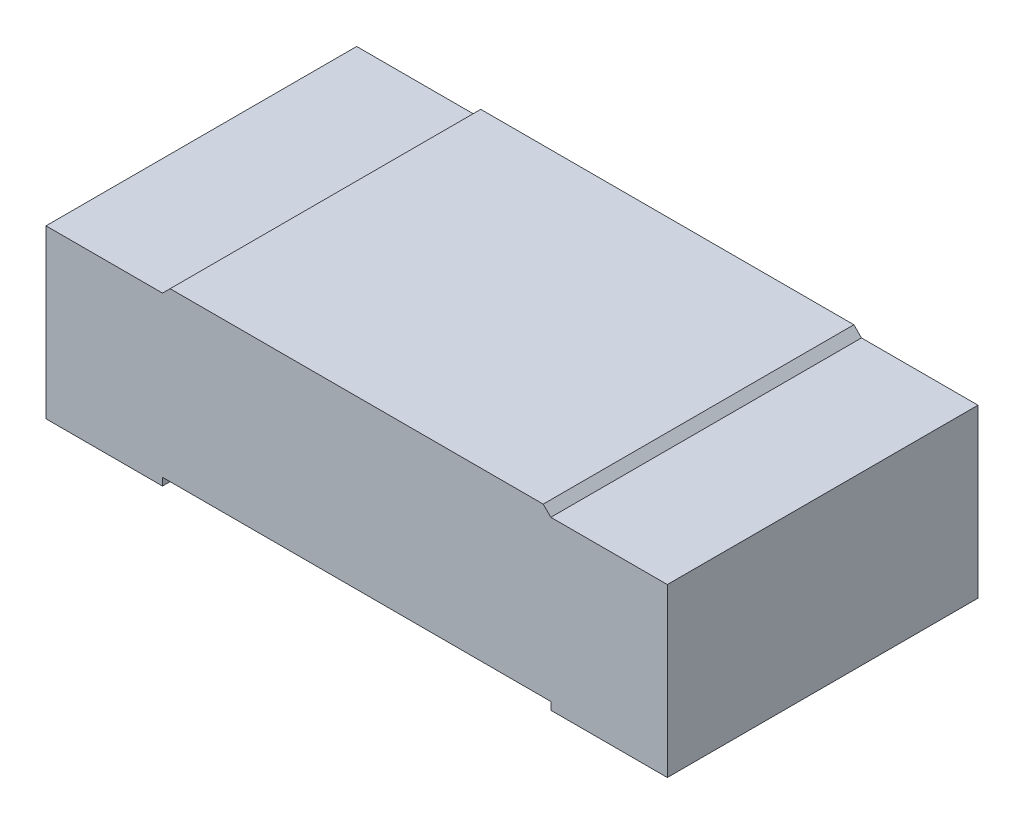
ISO-10303-21;
HEADER;
FILE_DESCRIPTION(('STEP AP214'),'2;1');
FILE_NAME('part.step','',(''),(''),'','','');
FILE_SCHEMA(('AUTOMOTIVE_DESIGN { 1 0 10303 214 1 1 1 1 }'));
ENDSEC;
DATA;
#1=APPLICATION_CONTEXT('core data for automotive mechanical design processes');
#2=APPLICATION_PROTOCOL_DEFINITION('international standard','automotive_design',2000,#1);
#3=PRODUCT_CONTEXT('',#1,'mechanical');
#4=PRODUCT('Part','Part','',(#3));
#5=PRODUCT_RELATED_PRODUCT_CATEGORY('part','',(#4));
#6=PRODUCT_DEFINITION_FORMATION('','',#4);
#7=PRODUCT_DEFINITION_CONTEXT('part definition',#1,'design');
#8=PRODUCT_DEFINITION('design','',#6,#7);
#9=PRODUCT_DEFINITION_SHAPE('','',#8);
#10=(LENGTH_UNIT() NAMED_UNIT(*) SI_UNIT(.MILLI.,.METRE.));
#11=(NAMED_UNIT(*) PLANE_ANGLE_UNIT() SI_UNIT($,.RADIAN.));
#12=(NAMED_UNIT(*) SI_UNIT($,.STERADIAN.) SOLID_ANGLE_UNIT());
#13=UNCERTAINTY_MEASURE_WITH_UNIT(LENGTH_MEASURE(1.E-05),#10,'distance_accuracy_value','');
#14=(GEOMETRIC_REPRESENTATION_CONTEXT(3) GLOBAL_UNCERTAINTY_ASSIGNED_CONTEXT((#13)) GLOBAL_UNIT_ASSIGNED_CONTEXT((#10,
#11,#12)) REPRESENTATION_CONTEXT('',''));
#15=CARTESIAN_POINT('',(0.,0.,0.));
#16=DIRECTION('',(0.,0.,1.));
#17=DIRECTION('',(1.,0.,0.));
#18=AXIS2_PLACEMENT_3D('',#15,#16,#17);
#19=CARTESIAN_POINT('',(-0.8,0.,-0.4));
#20=DIRECTION('',(-1.,0.,0.));
#21=DIRECTION('',(0.,0.,1.));
#22=AXIS2_PLACEMENT_3D('',#19,#20,#21);
#23=PLANE('',#22);
#24=DIRECTION('',(0.,1.,0.));
#25=VECTOR('',#24,1.);
#26=CARTESIAN_POINT('',(-0.8,0.,0.4));
#27=LINE('',#26,#25);
#28=CARTESIAN_POINT('',(-0.8,0.4303970200055,0.4));
#29=VERTEX_POINT('',#28);
#30=CARTESIAN_POINT('',(-0.8,0.,0.4));
#31=VERTEX_POINT('',#30);
#32=EDGE_CURVE('E155',#29,#31,#27,.F.);
#33=ORIENTED_EDGE('',*,*,#32,.F.);
#34=DIRECTION('',(0.,0.,-1.));
#35=VECTOR('',#34,1.);
#36=CARTESIAN_POINT('',(-0.8,0.4303970200055,0.4));
#37=LINE('',#36,#35);
#38=CARTESIAN_POINT('',(-0.8,0.4303970200055,-0.4));
#39=VERTEX_POINT('',#38);
#40=EDGE_CURVE('E20',#29,#39,#37,.T.);
#41=ORIENTED_EDGE('',*,*,#40,.T.);
#42=DIRECTION('',(0.,1.,0.));
#43=VECTOR('',#42,1.);
#44=CARTESIAN_POINT('',(-0.8,0.,-0.4));
#45=LINE('',#44,#43);
#46=CARTESIAN_POINT('',(-0.8,0.,-0.4));
#47=VERTEX_POINT('',#46);
#48=EDGE_CURVE('E154',#47,#39,#45,.T.);
#49=ORIENTED_EDGE('',*,*,#48,.F.);
#50=DIRECTION('',(0.,0.,1.));
#51=VECTOR('',#50,1.);
#52=CARTESIAN_POINT('',(-0.8,0.,0.));
#53=LINE('',#52,#51);
#54=EDGE_CURVE('E117',#47,#31,#53,.T.);
#55=ORIENTED_EDGE('',*,*,#54,.T.);
#56=EDGE_LOOP('',(#33,#41,#49,#55));
#57=FACE_BOUND('',#56,.T.);
#58=ADVANCED_FACE('F17',(#57),#23,.T.);
#59=CARTESIAN_POINT('',(-0.8,0.4303970200055,0.4));
#60=DIRECTION('',(0.,-1.,0.));
#61=DIRECTION('',(0.,0.,-1.));
#62=AXIS2_PLACEMENT_3D('',#59,#60,#61);
#63=PLANE('',#62);
#64=DIRECTION('',(0.,0.,1.));
#65=VECTOR('',#64,1.);
#66=CARTESIAN_POINT('',(-0.5,0.4303970200055,0.4));
#67=LINE('',#66,#65);
#68=CARTESIAN_POINT('',(-0.5,0.4303970200055,0.4));
#69=VERTEX_POINT('',#68);
#70=CARTESIAN_POINT('',(-0.5,0.4303970200055,-0.4));
#71=VERTEX_POINT('',#70);
#72=EDGE_CURVE('E144',#69,#71,#67,.F.);
#73=ORIENTED_EDGE('',*,*,#72,.T.);
#74=DIRECTION('',(-1.,0.,0.));
#75=VECTOR('',#74,1.);
#76=CARTESIAN_POINT('',(0.8,0.4303970200055,-0.4));
#77=LINE('',#76,#75);
#78=EDGE_CURVE('E157',#39,#71,#77,.F.);
#79=ORIENTED_EDGE('',*,*,#78,.F.);
#80=ORIENTED_EDGE('',*,*,#40,.F.);
#81=DIRECTION('',(1.,0.,0.));
#82=VECTOR('',#81,1.);
#83=CARTESIAN_POINT('',(-0.8,0.4303970200055,0.4));
#84=LINE('',#83,#82);
#85=EDGE_CURVE('E176',#69,#29,#84,.F.);
#86=ORIENTED_EDGE('',*,*,#85,.F.);
#87=EDGE_LOOP('',(#73,#79,#80,#86));
#88=FACE_BOUND('',#87,.T.);
#89=ADVANCED_FACE('F158',(#88),#63,.F.);
#90=CARTESIAN_POINT('',(-0.5,0.4303970200055,0.4));
#91=DIRECTION('',(0.707106781186548,-0.707106781186548,0.));
#92=DIRECTION('',(0.707106781186548,0.707106781186548,0.));
#93=AXIS2_PLACEMENT_3D('',#90,#91,#92);
#94=PLANE('',#93);
#95=ORIENTED_EDGE('',*,*,#72,.F.);
#96=DIRECTION('',(-0.70710678118835,-0.707106781184745,0.));
#97=VECTOR('',#96,1.);
#98=CARTESIAN_POINT('',(-0.4803970200054,0.45,0.4));
#99=LINE('',#98,#97);
#100=CARTESIAN_POINT('',(-0.480397020005413,0.450000000000013,0.4));
#101=VERTEX_POINT('',#100);
#102=EDGE_CURVE('E178',#101,#69,#99,.T.);
#103=ORIENTED_EDGE('',*,*,#102,.F.);
#104=DIRECTION('',(0.,0.,1.));
#105=VECTOR('',#104,1.);
#106=CARTESIAN_POINT('',(-0.4803970200054,0.45,0.));
#107=LINE('',#106,#105);
#108=CARTESIAN_POINT('',(-0.480397020005425,0.450000000000025,-0.4));
#109=VERTEX_POINT('',#108);
#110=EDGE_CURVE('E143',#109,#101,#107,.T.);
#111=ORIENTED_EDGE('',*,*,#110,.F.);
#112=DIRECTION('',(0.707106781188348,0.707106781184746,0.));
#113=VECTOR('',#112,1.);
#114=CARTESIAN_POINT('',(-0.5,0.4303970200055,-0.4));
#115=LINE('',#114,#113);
#116=EDGE_CURVE('E160',#71,#109,#115,.T.);
#117=ORIENTED_EDGE('',*,*,#116,.F.);
#118=EDGE_LOOP('',(#95,#103,#111,#117));
#119=FACE_BOUND('',#118,.T.);
#120=ADVANCED_FACE('F194',(#119),#94,.F.);
#121=CARTESIAN_POINT('',(0.,0.45,0.));
#122=DIRECTION('',(0.,1.,0.));
#123=DIRECTION('',(0.,0.,1.));
#124=AXIS2_PLACEMENT_3D('',#121,#122,#123);
#125=PLANE('',#124);
#126=DIRECTION('',(1.,0.,0.));
#127=VECTOR('',#126,1.);
#128=CARTESIAN_POINT('',(-0.8,0.45,0.4));
#129=LINE('',#128,#127);
#130=CARTESIAN_POINT('',(0.4803970200055,0.45,0.4));
#131=VERTEX_POINT('',#130);
#132=EDGE_CURVE('E181',#131,#101,#129,.F.);
#133=ORIENTED_EDGE('',*,*,#132,.F.);
#134=DIRECTION('',(0.,0.,1.));
#135=VECTOR('',#134,1.);
#136=CARTESIAN_POINT('',(0.4803970200055,0.45,0.4));
#137=LINE('',#136,#135);
#138=CARTESIAN_POINT('',(0.4803970200055,0.45,-0.4));
#139=VERTEX_POINT('',#138);
#140=EDGE_CURVE('E140',#131,#139,#137,.F.);
#141=ORIENTED_EDGE('',*,*,#140,.T.);
#142=DIRECTION('',(-1.,0.,0.));
#143=VECTOR('',#142,1.);
#144=CARTESIAN_POINT('',(0.8,0.45,-0.4));
#145=LINE('',#144,#143);
#146=EDGE_CURVE('E162',#109,#139,#145,.F.);
#147=ORIENTED_EDGE('',*,*,#146,.F.);
#148=ORIENTED_EDGE('',*,*,#110,.T.);
#149=EDGE_LOOP('',(#133,#141,#147,#148));
#150=FACE_BOUND('',#149,.T.);
#151=ADVANCED_FACE('F189',(#150),#125,.T.);
#152=CARTESIAN_POINT('',(0.4803970200055,0.45,0.4));
#153=DIRECTION('',(-0.707106781186548,-0.707106781186548,0.));
#154=DIRECTION('',(0.707106781186548,-0.707106781186548,0.));
#155=AXIS2_PLACEMENT_3D('',#152,#153,#154);
#156=PLANE('',#155);
#157=DIRECTION('',(0.,0.,-1.));
#158=VECTOR('',#157,1.);
#159=CARTESIAN_POINT('',(0.5,0.4303970200055,0.4));
#160=LINE('',#159,#158);
#161=CARTESIAN_POINT('',(0.5,0.4303970200055,0.4));
#162=VERTEX_POINT('',#161);
#163=CARTESIAN_POINT('',(0.5,0.4303970200055,-0.4));
#164=VERTEX_POINT('',#163);
#165=EDGE_CURVE('E137',#162,#164,#160,.T.);
#166=ORIENTED_EDGE('',*,*,#165,.T.);
#167=DIRECTION('',(0.707106781186547,-0.707106781186547,0.));
#168=VECTOR('',#167,1.);
#169=CARTESIAN_POINT('',(0.4803970200055,0.45,-0.4));
#170=LINE('',#169,#168);
#171=EDGE_CURVE('E215',#139,#164,#170,.T.);
#172=ORIENTED_EDGE('',*,*,#171,.F.);
#173=ORIENTED_EDGE('',*,*,#140,.F.);
#174=DIRECTION('',(-0.707106781186546,0.707106781186549,0.));
#175=VECTOR('',#174,1.);
#176=CARTESIAN_POINT('',(0.5,0.4303970200055,0.4));
#177=LINE('',#176,#175);
#178=EDGE_CURVE('E130',#162,#131,#177,.T.);
#179=ORIENTED_EDGE('',*,*,#178,.F.);
#180=EDGE_LOOP('',(#166,#172,#173,#179));
#181=FACE_BOUND('',#180,.T.);
#182=ADVANCED_FACE('F218',(#181),#156,.F.);
#183=CARTESIAN_POINT('',(0.5,0.4303970200055,0.4));
#184=DIRECTION('',(0.,-1.,0.));
#185=DIRECTION('',(0.,0.,-1.));
#186=AXIS2_PLACEMENT_3D('',#183,#184,#185);
#187=PLANE('',#186);
#188=DIRECTION('',(-1.,0.,0.));
#189=VECTOR('',#188,1.);
#190=CARTESIAN_POINT('',(0.8,0.4303970200055,-0.4));
#191=LINE('',#190,#189);
#192=CARTESIAN_POINT('',(0.8,0.4303970200055,-0.4));
#193=VERTEX_POINT('',#192);
#194=EDGE_CURVE('E213',#164,#193,#191,.F.);
#195=ORIENTED_EDGE('',*,*,#194,.F.);
#196=ORIENTED_EDGE('',*,*,#165,.F.);
#197=DIRECTION('',(1.,0.,0.));
#198=VECTOR('',#197,1.);
#199=CARTESIAN_POINT('',(-0.8,0.4303970200055,0.4));
#200=LINE('',#199,#198);
#201=CARTESIAN_POINT('',(0.8,0.4303970200055,0.4));
#202=VERTEX_POINT('',#201);
#203=EDGE_CURVE('E128',#202,#162,#200,.F.);
#204=ORIENTED_EDGE('',*,*,#203,.F.);
#205=DIRECTION('',(0.,0.,-1.));
#206=VECTOR('',#205,1.);
#207=CARTESIAN_POINT('',(0.8,0.4303970200055,0.4));
#208=LINE('',#207,#206);
#209=EDGE_CURVE('E103',#193,#202,#208,.F.);
#210=ORIENTED_EDGE('',*,*,#209,.F.);
#211=EDGE_LOOP('',(#195,#196,#204,#210));
#212=FACE_BOUND('',#211,.T.);
#213=ADVANCED_FACE('F220',(#212),#187,.F.);
#214=CARTESIAN_POINT('',(0.8,0.,0.4));
#215=DIRECTION('',(1.,0.,0.));
#216=DIRECTION('',(0.,0.,-1.));
#217=AXIS2_PLACEMENT_3D('',#214,#215,#216);
#218=PLANE('',#217);
#219=DIRECTION('',(0.,1.,0.));
#220=VECTOR('',#219,1.);
#221=CARTESIAN_POINT('',(0.8,0.,-0.4));
#222=LINE('',#221,#220);
#223=CARTESIAN_POINT('',(0.8,0.,-0.4));
#224=VERTEX_POINT('',#223);
#225=EDGE_CURVE('E211',#193,#224,#222,.F.);
#226=ORIENTED_EDGE('',*,*,#225,.F.);
#227=ORIENTED_EDGE('',*,*,#209,.T.);
#228=DIRECTION('',(0.,1.,0.));
#229=VECTOR('',#228,1.);
#230=CARTESIAN_POINT('',(0.8,0.,0.4));
#231=LINE('',#230,#229);
#232=CARTESIAN_POINT('',(0.8,0.,0.4));
#233=VERTEX_POINT('',#232);
#234=EDGE_CURVE('E123',#233,#202,#231,.T.);
#235=ORIENTED_EDGE('',*,*,#234,.F.);
#236=DIRECTION('',(0.,0.,1.));
#237=VECTOR('',#236,1.);
#238=CARTESIAN_POINT('',(0.8,0.,0.));
#239=LINE('',#238,#237);
#240=EDGE_CURVE('E110',#233,#224,#239,.F.);
#241=ORIENTED_EDGE('',*,*,#240,.T.);
#242=EDGE_LOOP('',(#226,#227,#235,#241));
#243=FACE_BOUND('',#242,.T.);
#244=ADVANCED_FACE('F127',(#243),#218,.T.);
#245=CARTESIAN_POINT('',(0.,0.,0.));
#246=DIRECTION('',(0.,1.,0.));
#247=DIRECTION('',(0.,0.,1.));
#248=AXIS2_PLACEMENT_3D('',#245,#246,#247);
#249=PLANE('',#248);
#250=ORIENTED_EDGE('',*,*,#240,.F.);
#251=DIRECTION('',(1.,0.,0.));
#252=VECTOR('',#251,1.);
#253=CARTESIAN_POINT('',(-0.8,0.,0.4));
#254=LINE('',#253,#252);
#255=CARTESIAN_POINT('',(0.5,0.,0.4));
#256=VERTEX_POINT('',#255);
#257=EDGE_CURVE('E114',#256,#233,#254,.T.);
#258=ORIENTED_EDGE('',*,*,#257,.F.);
#259=DIRECTION('',(0.,0.,-1.));
#260=VECTOR('',#259,1.);
#261=CARTESIAN_POINT('',(0.5,0.,0.4));
#262=LINE('',#261,#260);
#263=CARTESIAN_POINT('',(0.5,0.,-0.4));
#264=VERTEX_POINT('',#263);
#265=EDGE_CURVE('E171',#256,#264,#262,.T.);
#266=ORIENTED_EDGE('',*,*,#265,.T.);
#267=DIRECTION('',(-1.,0.,0.));
#268=VECTOR('',#267,1.);
#269=CARTESIAN_POINT('',(0.8,0.,-0.4));
#270=LINE('',#269,#268);
#271=EDGE_CURVE('E116',#224,#264,#270,.T.);
#272=ORIENTED_EDGE('',*,*,#271,.F.);
#273=EDGE_LOOP('',(#250,#258,#266,#272));
#274=FACE_BOUND('',#273,.T.);
#275=ADVANCED_FACE('F112',(#274),#249,.F.);
#276=CARTESIAN_POINT('',(0.,0.,0.));
#277=DIRECTION('',(0.,1.,0.));
#278=DIRECTION('',(0.,0.,1.));
#279=AXIS2_PLACEMENT_3D('',#276,#277,#278);
#280=PLANE('',#279);
#281=ORIENTED_EDGE('',*,*,#54,.F.);
#282=DIRECTION('',(-1.,0.,0.));
#283=VECTOR('',#282,1.);
#284=CARTESIAN_POINT('',(0.8,0.,-0.4));
#285=LINE('',#284,#283);
#286=CARTESIAN_POINT('',(-0.5,0.,-0.4));
#287=VERTEX_POINT('',#286);
#288=EDGE_CURVE('E164',#287,#47,#285,.T.);
#289=ORIENTED_EDGE('',*,*,#288,.F.);
#290=DIRECTION('',(0.,0.,1.));
#291=VECTOR('',#290,1.);
#292=CARTESIAN_POINT('',(-0.5,0.,0.4));
#293=LINE('',#292,#291);
#294=CARTESIAN_POINT('',(-0.5,0.,0.4));
#295=VERTEX_POINT('',#294);
#296=EDGE_CURVE('E202',#287,#295,#293,.T.);
#297=ORIENTED_EDGE('',*,*,#296,.T.);
#298=DIRECTION('',(1.,0.,0.));
#299=VECTOR('',#298,1.);
#300=CARTESIAN_POINT('',(-0.8,0.,0.4));
#301=LINE('',#300,#299);
#302=EDGE_CURVE('E173',#31,#295,#301,.T.);
#303=ORIENTED_EDGE('',*,*,#302,.F.);
#304=EDGE_LOOP('',(#281,#289,#297,#303));
#305=FACE_BOUND('',#304,.T.);
#306=ADVANCED_FACE('F201',(#305),#280,.F.);
#307=CARTESIAN_POINT('',(-0.8,0.,0.4));
#308=DIRECTION('',(0.,0.,1.));
#309=DIRECTION('',(1.,0.,0.));
#310=AXIS2_PLACEMENT_3D('',#307,#308,#309);
#311=PLANE('',#310);
#312=DIRECTION('',(1.,0.,0.));
#313=VECTOR('',#312,1.);
#314=CARTESIAN_POINT('',(0.5,0.01960297999455,0.4));
#315=LINE('',#314,#313);
#316=CARTESIAN_POINT('',(-0.5,0.01960297999455,0.4));
#317=VERTEX_POINT('',#316);
#318=CARTESIAN_POINT('',(0.5,0.01960297999455,0.4));
#319=VERTEX_POINT('',#318);
#320=EDGE_CURVE('E230',#317,#319,#315,.T.);
#321=ORIENTED_EDGE('',*,*,#320,.T.);
#322=DIRECTION('',(0.,1.,0.));
#323=VECTOR('',#322,1.);
#324=CARTESIAN_POINT('',(0.5,0.,0.4));
#325=LINE('',#324,#323);
#326=EDGE_CURVE('E125',#319,#256,#325,.F.);
#327=ORIENTED_EDGE('',*,*,#326,.T.);
#328=ORIENTED_EDGE('',*,*,#257,.T.);
#329=ORIENTED_EDGE('',*,*,#234,.T.);
#330=ORIENTED_EDGE('',*,*,#203,.T.);
#331=ORIENTED_EDGE('',*,*,#178,.T.);
#332=ORIENTED_EDGE('',*,*,#132,.T.);
#333=ORIENTED_EDGE('',*,*,#102,.T.);
#334=ORIENTED_EDGE('',*,*,#85,.T.);
#335=ORIENTED_EDGE('',*,*,#32,.T.);
#336=ORIENTED_EDGE('',*,*,#302,.T.);
#337=DIRECTION('',(0.,1.,0.));
#338=VECTOR('',#337,1.);
#339=CARTESIAN_POINT('',(-0.5,0.01960297999455,0.4));
#340=LINE('',#339,#338);
#341=EDGE_CURVE('E203',#295,#317,#340,.T.);
#342=ORIENTED_EDGE('',*,*,#341,.T.);
#343=EDGE_LOOP('',(#321,#327,#328,#329,#330,#331,#332,#333,#334,#335,#336,#342));
#344=FACE_BOUND('',#343,.T.);
#345=ADVANCED_FACE('F121',(#344),#311,.T.);
#346=CARTESIAN_POINT('',(0.5,0.,0.4));
#347=DIRECTION('',(1.,0.,0.));
#348=DIRECTION('',(0.,0.,-1.));
#349=AXIS2_PLACEMENT_3D('',#346,#347,#348);
#350=PLANE('',#349);
#351=DIRECTION('',(0.,0.,1.));
#352=VECTOR('',#351,1.);
#353=CARTESIAN_POINT('',(0.5,0.01960297999455,0.4));
#354=LINE('',#353,#352);
#355=CARTESIAN_POINT('',(0.5,0.01960297999455,-0.4));
#356=VERTEX_POINT('',#355);
#357=EDGE_CURVE('E228',#319,#356,#354,.F.);
#358=ORIENTED_EDGE('',*,*,#357,.T.);
#359=DIRECTION('',(0.,1.,0.));
#360=VECTOR('',#359,1.);
#361=CARTESIAN_POINT('',(0.5,0.,-0.4));
#362=LINE('',#361,#360);
#363=EDGE_CURVE('E204',#264,#356,#362,.T.);
#364=ORIENTED_EDGE('',*,*,#363,.F.);
#365=ORIENTED_EDGE('',*,*,#265,.F.);
#366=ORIENTED_EDGE('',*,*,#326,.F.);
#367=EDGE_LOOP('',(#358,#364,#365,#366));
#368=FACE_BOUND('',#367,.T.);
#369=ADVANCED_FACE('F226',(#368),#350,.F.);
#370=CARTESIAN_POINT('',(0.8,0.,-0.4));
#371=DIRECTION('',(0.,0.,-1.));
#372=DIRECTION('',(-1.,0.,0.));
#373=AXIS2_PLACEMENT_3D('',#370,#371,#372);
#374=PLANE('',#373);
#375=ORIENTED_EDGE('',*,*,#271,.T.);
#376=ORIENTED_EDGE('',*,*,#363,.T.);
#377=DIRECTION('',(1.,0.,0.));
#378=VECTOR('',#377,1.);
#379=CARTESIAN_POINT('',(0.5,0.01960297999455,-0.4));
#380=LINE('',#379,#378);
#381=CARTESIAN_POINT('',(-0.5,0.01960297999455,-0.4));
#382=VERTEX_POINT('',#381);
#383=EDGE_CURVE('E26',#356,#382,#380,.F.);
#384=ORIENTED_EDGE('',*,*,#383,.T.);
#385=DIRECTION('',(0.,1.,0.));
#386=VECTOR('',#385,1.);
#387=CARTESIAN_POINT('',(-0.5,0.01960297999455,-0.4));
#388=LINE('',#387,#386);
#389=EDGE_CURVE('E34',#382,#287,#388,.F.);
#390=ORIENTED_EDGE('',*,*,#389,.T.);
#391=ORIENTED_EDGE('',*,*,#288,.T.);
#392=ORIENTED_EDGE('',*,*,#48,.T.);
#393=ORIENTED_EDGE('',*,*,#78,.T.);
#394=ORIENTED_EDGE('',*,*,#116,.T.);
#395=ORIENTED_EDGE('',*,*,#146,.T.);
#396=ORIENTED_EDGE('',*,*,#171,.T.);
#397=ORIENTED_EDGE('',*,*,#194,.T.);
#398=ORIENTED_EDGE('',*,*,#225,.T.);
#399=EDGE_LOOP('',(#375,#376,#384,#390,#391,#392,#393,#394,#395,#396,#397,#398));
#400=FACE_BOUND('',#399,.T.);
#401=ADVANCED_FACE('F216',(#400),#374,.T.);
#402=CARTESIAN_POINT('',(-0.5,0.01960297999455,0.4));
#403=DIRECTION('',(-1.,0.,0.));
#404=DIRECTION('',(0.,0.,1.));
#405=AXIS2_PLACEMENT_3D('',#402,#403,#404);
#406=PLANE('',#405);
#407=DIRECTION('',(0.,0.,1.));
#408=VECTOR('',#407,1.);
#409=CARTESIAN_POINT('',(-0.5,0.01960297999455,0.4));
#410=LINE('',#409,#408);
#411=EDGE_CURVE('E11',#382,#317,#410,.T.);
#412=ORIENTED_EDGE('',*,*,#411,.T.);
#413=ORIENTED_EDGE('',*,*,#341,.F.);
#414=ORIENTED_EDGE('',*,*,#296,.F.);
#415=ORIENTED_EDGE('',*,*,#389,.F.);
#416=EDGE_LOOP('',(#412,#413,#414,#415));
#417=FACE_BOUND('',#416,.T.);
#418=ADVANCED_FACE('F235',(#417),#406,.F.);
#419=CARTESIAN_POINT('',(0.5,0.01960297999455,0.4));
#420=DIRECTION('',(0.,1.,0.));
#421=DIRECTION('',(0.,0.,1.));
#422=AXIS2_PLACEMENT_3D('',#419,#420,#421);
#423=PLANE('',#422);
#424=ORIENTED_EDGE('',*,*,#383,.F.);
#425=ORIENTED_EDGE('',*,*,#357,.F.);
#426=ORIENTED_EDGE('',*,*,#320,.F.);
#427=ORIENTED_EDGE('',*,*,#411,.F.);
#428=EDGE_LOOP('',(#424,#425,#426,#427));
#429=FACE_BOUND('',#428,.T.);
#430=ADVANCED_FACE('F234',(#429),#423,.F.);
#431=CLOSED_SHELL('',(#58,#89,#120,#151,#182,#213,#244,#275,#306,#345,#369,#401,#418,#430));
#432=MANIFOLD_SOLID_BREP('B1',#431);
#433=ADVANCED_BREP_SHAPE_REPRESENTATION('',(#18,#432),#14);
#434=SHAPE_DEFINITION_REPRESENTATION(#9,#433);
ENDSEC;
END-ISO-10303-21;
